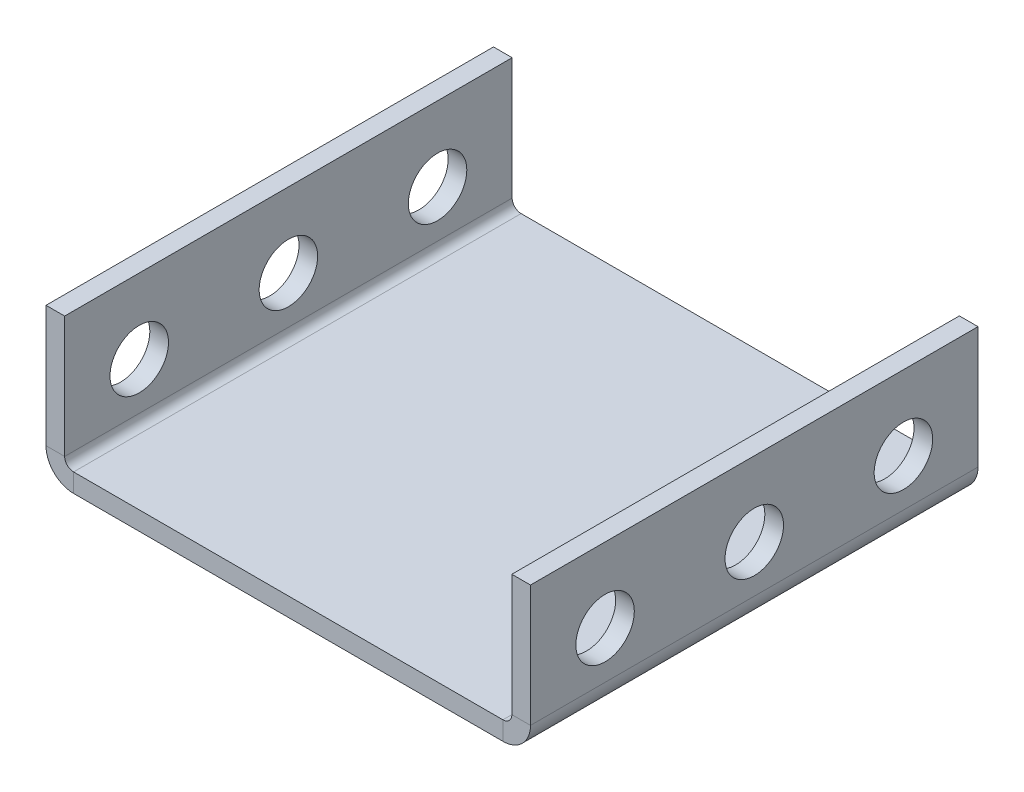
ISO-10303-21;
HEADER;
FILE_DESCRIPTION(('STEP AP214'),'2;1');
FILE_NAME('part.step','',(''),(''),'','','');
FILE_SCHEMA(('AUTOMOTIVE_DESIGN { 1 0 10303 214 1 1 1 1 }'));
ENDSEC;
DATA;
#1=APPLICATION_CONTEXT('core data for automotive mechanical design processes');
#2=APPLICATION_PROTOCOL_DEFINITION('international standard','automotive_design',2000,#1);
#3=PRODUCT_CONTEXT('',#1,'mechanical');
#4=PRODUCT('Part','Part','',(#3));
#5=PRODUCT_RELATED_PRODUCT_CATEGORY('part','',(#4));
#6=PRODUCT_DEFINITION_FORMATION('','',#4);
#7=PRODUCT_DEFINITION_CONTEXT('part definition',#1,'design');
#8=PRODUCT_DEFINITION('design','',#6,#7);
#9=PRODUCT_DEFINITION_SHAPE('','',#8);
#10=(LENGTH_UNIT() NAMED_UNIT(*) SI_UNIT(.MILLI.,.METRE.));
#11=(NAMED_UNIT(*) PLANE_ANGLE_UNIT() SI_UNIT($,.RADIAN.));
#12=(NAMED_UNIT(*) SI_UNIT($,.STERADIAN.) SOLID_ANGLE_UNIT());
#13=UNCERTAINTY_MEASURE_WITH_UNIT(LENGTH_MEASURE(1.E-05),#10,'distance_accuracy_value','');
#14=(GEOMETRIC_REPRESENTATION_CONTEXT(3) GLOBAL_UNCERTAINTY_ASSIGNED_CONTEXT((#13)) GLOBAL_UNIT_ASSIGNED_CONTEXT((#10,
#11,#12)) REPRESENTATION_CONTEXT('',''));
#15=CARTESIAN_POINT('',(0.,0.,0.));
#16=DIRECTION('',(0.,0.,1.));
#17=DIRECTION('',(1.,0.,0.));
#18=AXIS2_PLACEMENT_3D('',#15,#16,#17);
#19=CARTESIAN_POINT('',(18.2753,0.,38.1));
#20=DIRECTION('',(0.,0.,1.));
#21=DIRECTION('',(1.,0.,0.));
#22=AXIS2_PLACEMENT_3D('',#19,#20,#21);
#23=PLANE('',#22);
#24=DIRECTION('',(0.,1.,0.));
#25=VECTOR('',#24,1.);
#26=CARTESIAN_POINT('',(18.2753,0.,38.1));
#27=LINE('',#26,#25);
#28=CARTESIAN_POINT('',(18.2753,0.,38.1));
#29=VERTEX_POINT('',#28);
#30=CARTESIAN_POINT('',(18.2753,1.58750000000001,38.1));
#31=VERTEX_POINT('',#30);
#32=EDGE_CURVE('E11',#29,#31,#27,.T.);
#33=ORIENTED_EDGE('',*,*,#32,.F.);
#34=CARTESIAN_POINT('',(18.2753,2.34950000000001,38.1));
#35=DIRECTION('',(0.,0.,1.));
#36=DIRECTION('',(1.,0.,0.));
#37=AXIS2_PLACEMENT_3D('',#34,#35,#36);
#38=CIRCLE('',#37,2.3495);
#39=CARTESIAN_POINT('',(20.6248,2.34950000000001,38.1));
#40=VERTEX_POINT('',#39);
#41=EDGE_CURVE('E279',#40,#29,#38,.F.);
#42=ORIENTED_EDGE('',*,*,#41,.F.);
#43=DIRECTION('',(1.,0.,0.));
#44=VECTOR('',#43,1.);
#45=CARTESIAN_POINT('',(19.0373,2.34950000000001,38.1));
#46=LINE('',#45,#44);
#47=CARTESIAN_POINT('',(19.0373,2.34950000000001,38.1));
#48=VERTEX_POINT('',#47);
#49=EDGE_CURVE('E54',#48,#40,#46,.T.);
#50=ORIENTED_EDGE('',*,*,#49,.F.);
#51=CARTESIAN_POINT('',(18.2753,2.34950000000001,38.1));
#52=DIRECTION('',(0.,0.,1.));
#53=DIRECTION('',(1.,0.,0.));
#54=AXIS2_PLACEMENT_3D('',#51,#52,#53);
#55=CIRCLE('',#54,0.762);
#56=EDGE_CURVE('E156',#48,#31,#55,.F.);
#57=ORIENTED_EDGE('',*,*,#56,.T.);
#58=EDGE_LOOP('',(#33,#42,#50,#57));
#59=FACE_BOUND('',#58,.T.);
#60=ADVANCED_FACE('F45',(#59),#23,.T.);
#61=CARTESIAN_POINT('',(19.0373,2.34950000000001,38.1));
#62=DIRECTION('',(0.,0.,1.));
#63=DIRECTION('',(1.,0.,0.));
#64=AXIS2_PLACEMENT_3D('',#61,#62,#63);
#65=PLANE('',#64);
#66=DIRECTION('',(-1.,0.,0.));
#67=VECTOR('',#66,1.);
#68=CARTESIAN_POINT('',(-20.6248,0.,38.1));
#69=LINE('',#68,#67);
#70=CARTESIAN_POINT('',(-18.2753,0.,38.1));
#71=VERTEX_POINT('',#70);
#72=EDGE_CURVE('E150',#29,#71,#69,.T.);
#73=ORIENTED_EDGE('',*,*,#72,.F.);
#74=ORIENTED_EDGE('',*,*,#32,.T.);
#75=DIRECTION('',(-1.,0.,0.));
#76=VECTOR('',#75,1.);
#77=CARTESIAN_POINT('',(-20.6248,1.5875,38.1));
#78=LINE('',#77,#76);
#79=CARTESIAN_POINT('',(-18.2753,1.5875,38.1));
#80=VERTEX_POINT('',#79);
#81=EDGE_CURVE('E147',#31,#80,#78,.T.);
#82=ORIENTED_EDGE('',*,*,#81,.T.);
#83=DIRECTION('',(0.,-1.,0.));
#84=VECTOR('',#83,1.);
#85=CARTESIAN_POINT('',(-18.2753,1.5875,38.1));
#86=LINE('',#85,#84);
#87=EDGE_CURVE('E239',#80,#71,#86,.T.);
#88=ORIENTED_EDGE('',*,*,#87,.T.);
#89=EDGE_LOOP('',(#73,#74,#82,#88));
#90=FACE_BOUND('',#89,.T.);
#91=ADVANCED_FACE('F145',(#90),#65,.T.);
#92=CARTESIAN_POINT('',(20.6248,2.34950000000001,0.));
#93=DIRECTION('',(0.,0.,-1.));
#94=DIRECTION('',(-1.,0.,0.));
#95=AXIS2_PLACEMENT_3D('',#92,#93,#94);
#96=PLANE('',#95);
#97=DIRECTION('',(-1.,0.,0.));
#98=VECTOR('',#97,1.);
#99=CARTESIAN_POINT('',(20.6248,2.34950000000001,0.));
#100=LINE('',#99,#98);
#101=CARTESIAN_POINT('',(20.6248,2.34950000000001,0.));
#102=VERTEX_POINT('',#101);
#103=CARTESIAN_POINT('',(19.0373,2.34950000000001,0.));
#104=VERTEX_POINT('',#103);
#105=EDGE_CURVE('E244',#102,#104,#100,.T.);
#106=ORIENTED_EDGE('',*,*,#105,.F.);
#107=CARTESIAN_POINT('',(18.2753,2.34950000000001,0.));
#108=DIRECTION('',(0.,0.,1.));
#109=DIRECTION('',(1.,0.,0.));
#110=AXIS2_PLACEMENT_3D('',#107,#108,#109);
#111=CIRCLE('',#110,2.3495);
#112=CARTESIAN_POINT('',(18.2753,0.,0.));
#113=VERTEX_POINT('',#112);
#114=EDGE_CURVE('E196',#102,#113,#111,.F.);
#115=ORIENTED_EDGE('',*,*,#114,.T.);
#116=DIRECTION('',(0.,-1.,0.));
#117=VECTOR('',#116,1.);
#118=CARTESIAN_POINT('',(18.2753,1.58750000000001,0.));
#119=LINE('',#118,#117);
#120=CARTESIAN_POINT('',(18.2753,1.58750000000001,0.));
#121=VERTEX_POINT('',#120);
#122=EDGE_CURVE('E242',#121,#113,#119,.T.);
#123=ORIENTED_EDGE('',*,*,#122,.F.);
#124=CARTESIAN_POINT('',(18.2753,2.34950000000001,0.));
#125=DIRECTION('',(0.,0.,1.));
#126=DIRECTION('',(1.,0.,0.));
#127=AXIS2_PLACEMENT_3D('',#124,#125,#126);
#128=CIRCLE('',#127,0.762);
#129=EDGE_CURVE('E168',#104,#121,#128,.F.);
#130=ORIENTED_EDGE('',*,*,#129,.F.);
#131=EDGE_LOOP('',(#106,#115,#123,#130));
#132=FACE_BOUND('',#131,.T.);
#133=ADVANCED_FACE('F297',(#132),#96,.T.);
#134=CARTESIAN_POINT('',(18.2753,1.58750000000001,0.));
#135=DIRECTION('',(0.,0.,-1.));
#136=DIRECTION('',(-1.,0.,0.));
#137=AXIS2_PLACEMENT_3D('',#134,#135,#136);
#138=PLANE('',#137);
#139=DIRECTION('',(0.,-1.,0.));
#140=VECTOR('',#139,1.);
#141=CARTESIAN_POINT('',(20.6248,0.,0.));
#142=LINE('',#141,#140);
#143=CARTESIAN_POINT('',(20.6248,12.7,0.));
#144=VERTEX_POINT('',#143);
#145=EDGE_CURVE('E199',#144,#102,#142,.T.);
#146=ORIENTED_EDGE('',*,*,#145,.T.);
#147=ORIENTED_EDGE('',*,*,#105,.T.);
#148=DIRECTION('',(0.,-1.,0.));
#149=VECTOR('',#148,1.);
#150=CARTESIAN_POINT('',(19.0373,0.,0.));
#151=LINE('',#150,#149);
#152=CARTESIAN_POINT('',(19.0373,12.7,0.));
#153=VERTEX_POINT('',#152);
#154=EDGE_CURVE('E205',#153,#104,#151,.T.);
#155=ORIENTED_EDGE('',*,*,#154,.F.);
#156=DIRECTION('',(1.,0.,0.));
#157=VECTOR('',#156,1.);
#158=CARTESIAN_POINT('',(19.0373,12.7,0.));
#159=LINE('',#158,#157);
#160=EDGE_CURVE('E202',#153,#144,#159,.T.);
#161=ORIENTED_EDGE('',*,*,#160,.T.);
#162=EDGE_LOOP('',(#146,#147,#155,#161));
#163=FACE_BOUND('',#162,.T.);
#164=ADVANCED_FACE('F347',(#163),#138,.T.);
#165=CARTESIAN_POINT('',(-20.6248,2.3495,38.1));
#166=DIRECTION('',(0.,0.,1.));
#167=DIRECTION('',(1.,0.,0.));
#168=AXIS2_PLACEMENT_3D('',#165,#166,#167);
#169=PLANE('',#168);
#170=DIRECTION('',(1.,0.,0.));
#171=VECTOR('',#170,1.);
#172=CARTESIAN_POINT('',(-20.6248,2.3495,38.1));
#173=LINE('',#172,#171);
#174=CARTESIAN_POINT('',(-20.6248,2.3495,38.1));
#175=VERTEX_POINT('',#174);
#176=CARTESIAN_POINT('',(-19.0373,2.3495,38.1));
#177=VERTEX_POINT('',#176);
#178=EDGE_CURVE('E63',#175,#177,#173,.T.);
#179=ORIENTED_EDGE('',*,*,#178,.F.);
#180=CARTESIAN_POINT('',(-18.2753,2.3495,38.1));
#181=DIRECTION('',(0.,0.,1.));
#182=DIRECTION('',(1.,0.,0.));
#183=AXIS2_PLACEMENT_3D('',#180,#181,#182);
#184=CIRCLE('',#183,2.3495);
#185=EDGE_CURVE('E275',#71,#175,#184,.F.);
#186=ORIENTED_EDGE('',*,*,#185,.F.);
#187=ORIENTED_EDGE('',*,*,#87,.F.);
#188=CARTESIAN_POINT('',(-18.2753,2.3495,38.1));
#189=DIRECTION('',(0.,0.,1.));
#190=DIRECTION('',(1.,0.,0.));
#191=AXIS2_PLACEMENT_3D('',#188,#189,#190);
#192=CIRCLE('',#191,0.762);
#193=EDGE_CURVE('E176',#80,#177,#192,.F.);
#194=ORIENTED_EDGE('',*,*,#193,.T.);
#195=EDGE_LOOP('',(#179,#186,#187,#194));
#196=FACE_BOUND('',#195,.T.);
#197=ADVANCED_FACE('F352',(#196),#169,.T.);
#198=CARTESIAN_POINT('',(-18.2753,1.5875,38.1));
#199=DIRECTION('',(0.,0.,1.));
#200=DIRECTION('',(1.,0.,0.));
#201=AXIS2_PLACEMENT_3D('',#198,#199,#200);
#202=PLANE('',#201);
#203=DIRECTION('',(0.,1.,0.));
#204=VECTOR('',#203,1.);
#205=CARTESIAN_POINT('',(-20.6248,0.,38.1));
#206=LINE('',#205,#204);
#207=CARTESIAN_POINT('',(-20.6248,12.7,38.1));
#208=VERTEX_POINT('',#207);
#209=EDGE_CURVE('E272',#175,#208,#206,.T.);
#210=ORIENTED_EDGE('',*,*,#209,.F.);
#211=ORIENTED_EDGE('',*,*,#178,.T.);
#212=DIRECTION('',(0.,1.,0.));
#213=VECTOR('',#212,1.);
#214=CARTESIAN_POINT('',(-19.0373,0.,38.1));
#215=LINE('',#214,#213);
#216=CARTESIAN_POINT('',(-19.0373,12.7,38.1));
#217=VERTEX_POINT('',#216);
#218=EDGE_CURVE('E117',#177,#217,#215,.T.);
#219=ORIENTED_EDGE('',*,*,#218,.T.);
#220=DIRECTION('',(1.,0.,0.));
#221=VECTOR('',#220,1.);
#222=CARTESIAN_POINT('',(-20.6248,12.7,38.1));
#223=LINE('',#222,#221);
#224=EDGE_CURVE('E269',#208,#217,#223,.T.);
#225=ORIENTED_EDGE('',*,*,#224,.F.);
#226=EDGE_LOOP('',(#210,#211,#219,#225));
#227=FACE_BOUND('',#226,.T.);
#228=ADVANCED_FACE('F324',(#227),#202,.T.);
#229=CARTESIAN_POINT('',(-18.2753,0.,0.));
#230=DIRECTION('',(0.,0.,-1.));
#231=DIRECTION('',(-1.,0.,0.));
#232=AXIS2_PLACEMENT_3D('',#229,#230,#231);
#233=PLANE('',#232);
#234=DIRECTION('',(0.,1.,0.));
#235=VECTOR('',#234,1.);
#236=CARTESIAN_POINT('',(-18.2753,0.,0.));
#237=LINE('',#236,#235);
#238=CARTESIAN_POINT('',(-18.2753,0.,0.));
#239=VERTEX_POINT('',#238);
#240=CARTESIAN_POINT('',(-18.2753,1.5875,0.));
#241=VERTEX_POINT('',#240);
#242=EDGE_CURVE('E104',#239,#241,#237,.T.);
#243=ORIENTED_EDGE('',*,*,#242,.F.);
#244=CARTESIAN_POINT('',(-18.2753,2.3495,0.));
#245=DIRECTION('',(0.,0.,1.));
#246=DIRECTION('',(1.,0.,0.));
#247=AXIS2_PLACEMENT_3D('',#244,#245,#246);
#248=CIRCLE('',#247,2.3495);
#249=CARTESIAN_POINT('',(-20.6248,2.3495,0.));
#250=VERTEX_POINT('',#249);
#251=EDGE_CURVE('E192',#239,#250,#248,.F.);
#252=ORIENTED_EDGE('',*,*,#251,.T.);
#253=DIRECTION('',(-1.,0.,0.));
#254=VECTOR('',#253,1.);
#255=CARTESIAN_POINT('',(-19.0373,2.3495,0.));
#256=LINE('',#255,#254);
#257=CARTESIAN_POINT('',(-19.0373,2.3495,0.));
#258=VERTEX_POINT('',#257);
#259=EDGE_CURVE('E111',#258,#250,#256,.T.);
#260=ORIENTED_EDGE('',*,*,#259,.F.);
#261=CARTESIAN_POINT('',(-18.2753,2.3495,0.));
#262=DIRECTION('',(0.,0.,1.));
#263=DIRECTION('',(1.,0.,0.));
#264=AXIS2_PLACEMENT_3D('',#261,#262,#263);
#265=CIRCLE('',#264,0.762);
#266=EDGE_CURVE('E211',#241,#258,#265,.F.);
#267=ORIENTED_EDGE('',*,*,#266,.F.);
#268=EDGE_LOOP('',(#243,#252,#260,#267));
#269=FACE_BOUND('',#268,.T.);
#270=ADVANCED_FACE('F312',(#269),#233,.T.);
#271=CARTESIAN_POINT('',(-19.0373,2.3495,0.));
#272=DIRECTION('',(0.,0.,-1.));
#273=DIRECTION('',(-1.,0.,0.));
#274=AXIS2_PLACEMENT_3D('',#271,#272,#273);
#275=PLANE('',#274);
#276=DIRECTION('',(-1.,0.,0.));
#277=VECTOR('',#276,1.);
#278=CARTESIAN_POINT('',(-20.6248,0.,0.));
#279=LINE('',#278,#277);
#280=EDGE_CURVE('E194',#113,#239,#279,.T.);
#281=ORIENTED_EDGE('',*,*,#280,.T.);
#282=ORIENTED_EDGE('',*,*,#242,.T.);
#283=DIRECTION('',(-1.,0.,0.));
#284=VECTOR('',#283,1.);
#285=CARTESIAN_POINT('',(-20.6248,1.5875,0.));
#286=LINE('',#285,#284);
#287=EDGE_CURVE('E209',#121,#241,#286,.T.);
#288=ORIENTED_EDGE('',*,*,#287,.F.);
#289=ORIENTED_EDGE('',*,*,#122,.T.);
#290=EDGE_LOOP('',(#281,#282,#288,#289));
#291=FACE_BOUND('',#290,.T.);
#292=ADVANCED_FACE('F299',(#291),#275,.T.);
#293=CARTESIAN_POINT('',(-19.0373,0.,38.1));
#294=DIRECTION('',(-1.,0.,0.));
#295=DIRECTION('',(0.,-1.,0.));
#296=AXIS2_PLACEMENT_3D('',#293,#294,#295);
#297=PLANE('',#296);
#298=CARTESIAN_POINT('',(-19.0373,6.35000000000001,31.75));
#299=DIRECTION('',(-1.,0.,0.));
#300=DIRECTION('',(0.,-1.,0.));
#301=AXIS2_PLACEMENT_3D('',#298,#299,#300);
#302=CIRCLE('',#301,2.4892);
#303=CARTESIAN_POINT('',(-19.0373,3.86080000000001,31.75));
#304=VERTEX_POINT('',#303);
#305=EDGE_CURVE('E186',#304,#304,#302,.T.);
#306=ORIENTED_EDGE('',*,*,#305,.T.);
#307=EDGE_LOOP('',(#306));
#308=FACE_BOUND('',#307,.T.);
#309=CARTESIAN_POINT('',(-19.0373,6.35000000000001,19.05));
#310=DIRECTION('',(-1.,0.,0.));
#311=DIRECTION('',(0.,-1.,0.));
#312=AXIS2_PLACEMENT_3D('',#309,#310,#311);
#313=CIRCLE('',#312,2.4892);
#314=CARTESIAN_POINT('',(-19.0373,3.8608,19.05));
#315=VERTEX_POINT('',#314);
#316=EDGE_CURVE('E253',#315,#315,#313,.T.);
#317=ORIENTED_EDGE('',*,*,#316,.T.);
#318=EDGE_LOOP('',(#317));
#319=FACE_BOUND('',#318,.T.);
#320=CARTESIAN_POINT('',(-19.0373,6.35000000000001,6.35000000000001));
#321=DIRECTION('',(-1.,0.,0.));
#322=DIRECTION('',(0.,-1.,0.));
#323=AXIS2_PLACEMENT_3D('',#320,#321,#322);
#324=CIRCLE('',#323,2.4892);
#325=CARTESIAN_POINT('',(-19.0373,3.86080000000001,6.35000000000001));
#326=VERTEX_POINT('',#325);
#327=EDGE_CURVE('E249',#326,#326,#324,.T.);
#328=ORIENTED_EDGE('',*,*,#327,.T.);
#329=EDGE_LOOP('',(#328));
#330=FACE_BOUND('',#329,.T.);
#331=DIRECTION('',(0.,1.,0.));
#332=VECTOR('',#331,1.);
#333=CARTESIAN_POINT('',(-19.0373,0.,0.));
#334=LINE('',#333,#332);
#335=CARTESIAN_POINT('',(-19.0373,12.7,0.));
#336=VERTEX_POINT('',#335);
#337=EDGE_CURVE('E182',#258,#336,#334,.T.);
#338=ORIENTED_EDGE('',*,*,#337,.T.);
#339=DIRECTION('',(0.,0.,-1.));
#340=VECTOR('',#339,1.);
#341=CARTESIAN_POINT('',(-19.0373,12.7,38.1));
#342=LINE('',#341,#340);
#343=EDGE_CURVE('E235',#217,#336,#342,.T.);
#344=ORIENTED_EDGE('',*,*,#343,.F.);
#345=ORIENTED_EDGE('',*,*,#218,.F.);
#346=DIRECTION('',(0.,0.,-1.));
#347=VECTOR('',#346,1.);
#348=CARTESIAN_POINT('',(-19.0373,2.3495,38.1));
#349=LINE('',#348,#347);
#350=EDGE_CURVE('E178',#177,#258,#349,.T.);
#351=ORIENTED_EDGE('',*,*,#350,.T.);
#352=EDGE_LOOP('',(#338,#344,#345,#351));
#353=FACE_BOUND('',#352,.T.);
#354=ADVANCED_FACE('F318',(#308,#319,#330,#353),#297,.F.);
#355=CARTESIAN_POINT('',(-20.6248,12.7,38.1));
#356=DIRECTION('',(0.,1.,0.));
#357=DIRECTION('',(0.,0.,1.));
#358=AXIS2_PLACEMENT_3D('',#355,#356,#357);
#359=PLANE('',#358);
#360=DIRECTION('',(1.,0.,0.));
#361=VECTOR('',#360,1.);
#362=CARTESIAN_POINT('',(-20.6248,12.7,0.));
#363=LINE('',#362,#361);
#364=CARTESIAN_POINT('',(-20.6248,12.7,0.));
#365=VERTEX_POINT('',#364);
#366=EDGE_CURVE('E185',#365,#336,#363,.T.);
#367=ORIENTED_EDGE('',*,*,#366,.F.);
#368=DIRECTION('',(0.,0.,-1.));
#369=VECTOR('',#368,1.);
#370=CARTESIAN_POINT('',(-20.6248,12.7,38.1));
#371=LINE('',#370,#369);
#372=EDGE_CURVE('E233',#208,#365,#371,.T.);
#373=ORIENTED_EDGE('',*,*,#372,.F.);
#374=ORIENTED_EDGE('',*,*,#224,.T.);
#375=ORIENTED_EDGE('',*,*,#343,.T.);
#376=EDGE_LOOP('',(#367,#373,#374,#375));
#377=FACE_BOUND('',#376,.T.);
#378=ADVANCED_FACE('F323',(#377),#359,.T.);
#379=CARTESIAN_POINT('',(-20.6248,0.,38.1));
#380=DIRECTION('',(-1.,0.,0.));
#381=DIRECTION('',(0.,-1.,0.));
#382=AXIS2_PLACEMENT_3D('',#379,#380,#381);
#383=PLANE('',#382);
#384=CARTESIAN_POINT('',(-20.6248,6.35000000000001,31.75));
#385=DIRECTION('',(1.,0.,0.));
#386=DIRECTION('',(0.,0.,-1.));
#387=AXIS2_PLACEMENT_3D('',#384,#385,#386);
#388=CIRCLE('',#387,2.4892);
#389=CARTESIAN_POINT('',(-20.6248,6.35000000000001,29.2608));
#390=VERTEX_POINT('',#389);
#391=EDGE_CURVE('E250',#390,#390,#388,.T.);
#392=ORIENTED_EDGE('',*,*,#391,.T.);
#393=EDGE_LOOP('',(#392));
#394=FACE_BOUND('',#393,.T.);
#395=CARTESIAN_POINT('',(-20.6248,6.35000000000001,19.05));
#396=DIRECTION('',(1.,0.,0.));
#397=DIRECTION('',(0.,0.,-1.));
#398=AXIS2_PLACEMENT_3D('',#395,#396,#397);
#399=CIRCLE('',#398,2.4892);
#400=CARTESIAN_POINT('',(-20.6248,6.35000000000001,16.5608));
#401=VERTEX_POINT('',#400);
#402=EDGE_CURVE('E403',#401,#401,#399,.T.);
#403=ORIENTED_EDGE('',*,*,#402,.T.);
#404=EDGE_LOOP('',(#403));
#405=FACE_BOUND('',#404,.T.);
#406=CARTESIAN_POINT('',(-20.6248,6.35000000000001,6.35000000000001));
#407=DIRECTION('',(1.,0.,0.));
#408=DIRECTION('',(0.,0.,-1.));
#409=AXIS2_PLACEMENT_3D('',#406,#407,#408);
#410=CIRCLE('',#409,2.4892);
#411=CARTESIAN_POINT('',(-20.6248,6.35000000000001,3.86080000000001));
#412=VERTEX_POINT('',#411);
#413=EDGE_CURVE('E410',#412,#412,#410,.T.);
#414=ORIENTED_EDGE('',*,*,#413,.T.);
#415=EDGE_LOOP('',(#414));
#416=FACE_BOUND('',#415,.T.);
#417=DIRECTION('',(0.,1.,0.));
#418=VECTOR('',#417,1.);
#419=CARTESIAN_POINT('',(-20.6248,0.,0.));
#420=LINE('',#419,#418);
#421=EDGE_CURVE('E189',#250,#365,#420,.T.);
#422=ORIENTED_EDGE('',*,*,#421,.F.);
#423=DIRECTION('',(0.,0.,-1.));
#424=VECTOR('',#423,1.);
#425=CARTESIAN_POINT('',(-20.6248,2.3495,38.1));
#426=LINE('',#425,#424);
#427=EDGE_CURVE('E230',#175,#250,#426,.T.);
#428=ORIENTED_EDGE('',*,*,#427,.F.);
#429=ORIENTED_EDGE('',*,*,#209,.T.);
#430=ORIENTED_EDGE('',*,*,#372,.T.);
#431=EDGE_LOOP('',(#422,#428,#429,#430));
#432=FACE_BOUND('',#431,.T.);
#433=ADVANCED_FACE('F326',(#394,#405,#416,#432),#383,.T.);
#434=CARTESIAN_POINT('',(-18.2753,2.3495,38.1));
#435=DIRECTION('',(0.,0.,-1.));
#436=DIRECTION('',(-1.,0.,0.));
#437=AXIS2_PLACEMENT_3D('',#434,#435,#436);
#438=CYLINDRICAL_SURFACE('',#437,2.3495);
#439=ORIENTED_EDGE('',*,*,#251,.F.);
#440=DIRECTION('',(0.,0.,-1.));
#441=VECTOR('',#440,1.);
#442=CARTESIAN_POINT('',(-18.2753,0.,38.1));
#443=LINE('',#442,#441);
#444=EDGE_CURVE('E227',#71,#239,#443,.T.);
#445=ORIENTED_EDGE('',*,*,#444,.F.);
#446=ORIENTED_EDGE('',*,*,#185,.T.);
#447=ORIENTED_EDGE('',*,*,#427,.T.);
#448=EDGE_LOOP('',(#439,#445,#446,#447));
#449=FACE_BOUND('',#448,.T.);
#450=ADVANCED_FACE('F309',(#449),#438,.T.);
#451=CARTESIAN_POINT('',(-20.6248,0.,38.1));
#452=DIRECTION('',(0.,-1.,0.));
#453=DIRECTION('',(1.,0.,0.));
#454=AXIS2_PLACEMENT_3D('',#451,#452,#453);
#455=PLANE('',#454);
#456=ORIENTED_EDGE('',*,*,#280,.F.);
#457=DIRECTION('',(0.,0.,-1.));
#458=VECTOR('',#457,1.);
#459=CARTESIAN_POINT('',(18.2753,0.,38.1));
#460=LINE('',#459,#458);
#461=EDGE_CURVE('E224',#29,#113,#460,.T.);
#462=ORIENTED_EDGE('',*,*,#461,.F.);
#463=ORIENTED_EDGE('',*,*,#72,.T.);
#464=ORIENTED_EDGE('',*,*,#444,.T.);
#465=EDGE_LOOP('',(#456,#462,#463,#464));
#466=FACE_BOUND('',#465,.T.);
#467=ADVANCED_FACE('F304',(#466),#455,.T.);
#468=CARTESIAN_POINT('',(18.2753,2.34950000000001,38.1));
#469=DIRECTION('',(0.,0.,-1.));
#470=DIRECTION('',(-1.,0.,0.));
#471=AXIS2_PLACEMENT_3D('',#468,#469,#470);
#472=CYLINDRICAL_SURFACE('',#471,2.3495);
#473=ORIENTED_EDGE('',*,*,#114,.F.);
#474=DIRECTION('',(0.,0.,-1.));
#475=VECTOR('',#474,1.);
#476=CARTESIAN_POINT('',(20.6248,2.34950000000001,38.1));
#477=LINE('',#476,#475);
#478=EDGE_CURVE('E221',#40,#102,#477,.T.);
#479=ORIENTED_EDGE('',*,*,#478,.F.);
#480=ORIENTED_EDGE('',*,*,#41,.T.);
#481=ORIENTED_EDGE('',*,*,#461,.T.);
#482=EDGE_LOOP('',(#473,#479,#480,#481));
#483=FACE_BOUND('',#482,.T.);
#484=ADVANCED_FACE('F302',(#483),#472,.T.);
#485=CARTESIAN_POINT('',(20.6248,0.,38.1));
#486=DIRECTION('',(1.,0.,0.));
#487=DIRECTION('',(0.,1.,0.));
#488=AXIS2_PLACEMENT_3D('',#485,#486,#487);
#489=PLANE('',#488);
#490=CARTESIAN_POINT('',(20.6248,6.35000000000001,31.75));
#491=DIRECTION('',(1.,0.,0.));
#492=DIRECTION('',(0.,0.,-1.));
#493=AXIS2_PLACEMENT_3D('',#490,#491,#492);
#494=CIRCLE('',#493,2.4892);
#495=CARTESIAN_POINT('',(20.6248,6.35000000000001,29.2608));
#496=VERTEX_POINT('',#495);
#497=EDGE_CURVE('E402',#496,#496,#494,.T.);
#498=ORIENTED_EDGE('',*,*,#497,.F.);
#499=EDGE_LOOP('',(#498));
#500=FACE_BOUND('',#499,.T.);
#501=CARTESIAN_POINT('',(20.6248,6.35000000000001,19.05));
#502=DIRECTION('',(1.,0.,0.));
#503=DIRECTION('',(0.,0.,-1.));
#504=AXIS2_PLACEMENT_3D('',#501,#502,#503);
#505=CIRCLE('',#504,2.4892);
#506=CARTESIAN_POINT('',(20.6248,6.35000000000001,16.5608));
#507=VERTEX_POINT('',#506);
#508=EDGE_CURVE('E400',#507,#507,#505,.T.);
#509=ORIENTED_EDGE('',*,*,#508,.F.);
#510=EDGE_LOOP('',(#509));
#511=FACE_BOUND('',#510,.T.);
#512=CARTESIAN_POINT('',(20.6248,6.35000000000001,6.35000000000001));
#513=DIRECTION('',(1.,0.,0.));
#514=DIRECTION('',(0.,0.,-1.));
#515=AXIS2_PLACEMENT_3D('',#512,#513,#514);
#516=CIRCLE('',#515,2.4892);
#517=CARTESIAN_POINT('',(20.6248,6.35000000000001,3.86080000000001));
#518=VERTEX_POINT('',#517);
#519=EDGE_CURVE('E263',#518,#518,#516,.T.);
#520=ORIENTED_EDGE('',*,*,#519,.F.);
#521=EDGE_LOOP('',(#520));
#522=FACE_BOUND('',#521,.T.);
#523=ORIENTED_EDGE('',*,*,#145,.F.);
#524=DIRECTION('',(0.,0.,-1.));
#525=VECTOR('',#524,1.);
#526=CARTESIAN_POINT('',(20.6248,12.7,38.1));
#527=LINE('',#526,#525);
#528=CARTESIAN_POINT('',(20.6248,12.7,38.1));
#529=VERTEX_POINT('',#528);
#530=EDGE_CURVE('E219',#529,#144,#527,.T.);
#531=ORIENTED_EDGE('',*,*,#530,.F.);
#532=DIRECTION('',(0.,-1.,0.));
#533=VECTOR('',#532,1.);
#534=CARTESIAN_POINT('',(20.6248,0.,38.1));
#535=LINE('',#534,#533);
#536=EDGE_CURVE('E281',#529,#40,#535,.T.);
#537=ORIENTED_EDGE('',*,*,#536,.T.);
#538=ORIENTED_EDGE('',*,*,#478,.T.);
#539=EDGE_LOOP('',(#523,#531,#537,#538));
#540=FACE_BOUND('',#539,.T.);
#541=ADVANCED_FACE('F418',(#500,#511,#522,#540),#489,.T.);
#542=CARTESIAN_POINT('',(19.0373,12.7,38.1));
#543=DIRECTION('',(0.,1.,0.));
#544=DIRECTION('',(0.,0.,1.));
#545=AXIS2_PLACEMENT_3D('',#542,#543,#544);
#546=PLANE('',#545);
#547=ORIENTED_EDGE('',*,*,#160,.F.);
#548=DIRECTION('',(0.,0.,-1.));
#549=VECTOR('',#548,1.);
#550=CARTESIAN_POINT('',(19.0373,12.7,38.1));
#551=LINE('',#550,#549);
#552=CARTESIAN_POINT('',(19.0373,12.7,38.1));
#553=VERTEX_POINT('',#552);
#554=EDGE_CURVE('E217',#553,#153,#551,.T.);
#555=ORIENTED_EDGE('',*,*,#554,.F.);
#556=DIRECTION('',(1.,0.,0.));
#557=VECTOR('',#556,1.);
#558=CARTESIAN_POINT('',(19.0373,12.7,38.1));
#559=LINE('',#558,#557);
#560=EDGE_CURVE('E284',#553,#529,#559,.T.);
#561=ORIENTED_EDGE('',*,*,#560,.T.);
#562=ORIENTED_EDGE('',*,*,#530,.T.);
#563=EDGE_LOOP('',(#547,#555,#561,#562));
#564=FACE_BOUND('',#563,.T.);
#565=ADVANCED_FACE('F420',(#564),#546,.T.);
#566=CARTESIAN_POINT('',(19.0373,0.,38.1));
#567=DIRECTION('',(1.,0.,0.));
#568=DIRECTION('',(0.,1.,0.));
#569=AXIS2_PLACEMENT_3D('',#566,#567,#568);
#570=PLANE('',#569);
#571=CARTESIAN_POINT('',(19.0373,6.35000000000001,31.75));
#572=DIRECTION('',(1.,0.,0.));
#573=DIRECTION('',(0.,1.,0.));
#574=AXIS2_PLACEMENT_3D('',#571,#572,#573);
#575=CIRCLE('',#574,2.4892);
#576=CARTESIAN_POINT('',(19.0373,8.8392,31.75));
#577=VERTEX_POINT('',#576);
#578=EDGE_CURVE('E48',#577,#577,#575,.T.);
#579=ORIENTED_EDGE('',*,*,#578,.T.);
#580=EDGE_LOOP('',(#579));
#581=FACE_BOUND('',#580,.T.);
#582=CARTESIAN_POINT('',(19.0373,6.35000000000001,19.05));
#583=DIRECTION('',(1.,0.,0.));
#584=DIRECTION('',(0.,1.,0.));
#585=AXIS2_PLACEMENT_3D('',#582,#583,#584);
#586=CIRCLE('',#585,2.4892);
#587=CARTESIAN_POINT('',(19.0373,8.83920000000001,19.05));
#588=VERTEX_POINT('',#587);
#589=EDGE_CURVE('E251',#588,#588,#586,.T.);
#590=ORIENTED_EDGE('',*,*,#589,.T.);
#591=EDGE_LOOP('',(#590));
#592=FACE_BOUND('',#591,.T.);
#593=CARTESIAN_POINT('',(19.0373,6.35000000000001,6.35000000000001));
#594=DIRECTION('',(1.,0.,0.));
#595=DIRECTION('',(0.,1.,0.));
#596=AXIS2_PLACEMENT_3D('',#593,#594,#595);
#597=CIRCLE('',#596,2.4892);
#598=CARTESIAN_POINT('',(19.0373,8.8392,6.35000000000001));
#599=VERTEX_POINT('',#598);
#600=EDGE_CURVE('E247',#599,#599,#597,.T.);
#601=ORIENTED_EDGE('',*,*,#600,.T.);
#602=EDGE_LOOP('',(#601));
#603=FACE_BOUND('',#602,.T.);
#604=ORIENTED_EDGE('',*,*,#154,.T.);
#605=DIRECTION('',(0.,0.,-1.));
#606=VECTOR('',#605,1.);
#607=CARTESIAN_POINT('',(19.0373,2.34950000000001,38.1));
#608=LINE('',#607,#606);
#609=EDGE_CURVE('E170',#48,#104,#608,.T.);
#610=ORIENTED_EDGE('',*,*,#609,.F.);
#611=DIRECTION('',(0.,-1.,0.));
#612=VECTOR('',#611,1.);
#613=CARTESIAN_POINT('',(19.0373,0.,38.1));
#614=LINE('',#613,#612);
#615=EDGE_CURVE('E161',#553,#48,#614,.T.);
#616=ORIENTED_EDGE('',*,*,#615,.F.);
#617=ORIENTED_EDGE('',*,*,#554,.T.);
#618=EDGE_LOOP('',(#604,#610,#616,#617));
#619=FACE_BOUND('',#618,.T.);
#620=ADVANCED_FACE('F294',(#581,#592,#603,#619),#570,.F.);
#621=CARTESIAN_POINT('',(18.2753,2.34950000000001,38.1));
#622=DIRECTION('',(0.,0.,-1.));
#623=DIRECTION('',(-1.,0.,0.));
#624=AXIS2_PLACEMENT_3D('',#621,#622,#623);
#625=CYLINDRICAL_SURFACE('',#624,0.762);
#626=ORIENTED_EDGE('',*,*,#129,.T.);
#627=DIRECTION('',(0.,0.,-1.));
#628=VECTOR('',#627,1.);
#629=CARTESIAN_POINT('',(18.2753,1.58750000000001,38.1));
#630=LINE('',#629,#628);
#631=EDGE_CURVE('E165',#31,#121,#630,.T.);
#632=ORIENTED_EDGE('',*,*,#631,.F.);
#633=ORIENTED_EDGE('',*,*,#56,.F.);
#634=ORIENTED_EDGE('',*,*,#609,.T.);
#635=EDGE_LOOP('',(#626,#632,#633,#634));
#636=FACE_BOUND('',#635,.T.);
#637=ADVANCED_FACE('F166',(#636),#625,.F.);
#638=CARTESIAN_POINT('',(-20.6248,1.5875,38.1));
#639=DIRECTION('',(0.,-1.,0.));
#640=DIRECTION('',(1.,0.,0.));
#641=AXIS2_PLACEMENT_3D('',#638,#639,#640);
#642=PLANE('',#641);
#643=ORIENTED_EDGE('',*,*,#287,.T.);
#644=DIRECTION('',(0.,0.,-1.));
#645=VECTOR('',#644,1.);
#646=CARTESIAN_POINT('',(-18.2753,1.5875,38.1));
#647=LINE('',#646,#645);
#648=EDGE_CURVE('E171',#80,#241,#647,.T.);
#649=ORIENTED_EDGE('',*,*,#648,.F.);
#650=ORIENTED_EDGE('',*,*,#81,.F.);
#651=ORIENTED_EDGE('',*,*,#631,.T.);
#652=EDGE_LOOP('',(#643,#649,#650,#651));
#653=FACE_BOUND('',#652,.T.);
#654=ADVANCED_FACE('F173',(#653),#642,.F.);
#655=CARTESIAN_POINT('',(-18.2753,2.3495,38.1));
#656=DIRECTION('',(0.,0.,-1.));
#657=DIRECTION('',(-1.,0.,0.));
#658=AXIS2_PLACEMENT_3D('',#655,#656,#657);
#659=CYLINDRICAL_SURFACE('',#658,0.762);
#660=ORIENTED_EDGE('',*,*,#266,.T.);
#661=ORIENTED_EDGE('',*,*,#350,.F.);
#662=ORIENTED_EDGE('',*,*,#193,.F.);
#663=ORIENTED_EDGE('',*,*,#648,.T.);
#664=EDGE_LOOP('',(#660,#661,#662,#663));
#665=FACE_BOUND('',#664,.T.);
#666=ADVANCED_FACE('F315',(#665),#659,.F.);
#667=CARTESIAN_POINT('',(-18.2753,2.3495,38.1));
#668=DIRECTION('',(0.,0.,1.));
#669=DIRECTION('',(1.,0.,0.));
#670=AXIS2_PLACEMENT_3D('',#667,#668,#669);
#671=PLANE('',#670);
#672=ORIENTED_EDGE('',*,*,#615,.T.);
#673=ORIENTED_EDGE('',*,*,#49,.T.);
#674=ORIENTED_EDGE('',*,*,#536,.F.);
#675=ORIENTED_EDGE('',*,*,#560,.F.);
#676=EDGE_LOOP('',(#672,#673,#674,#675));
#677=FACE_BOUND('',#676,.T.);
#678=ADVANCED_FACE('F290',(#677),#671,.T.);
#679=CARTESIAN_POINT('',(-18.2753,2.3495,0.));
#680=DIRECTION('',(0.,0.,1.));
#681=DIRECTION('',(1.,0.,0.));
#682=AXIS2_PLACEMENT_3D('',#679,#680,#681);
#683=PLANE('',#682);
#684=ORIENTED_EDGE('',*,*,#337,.F.);
#685=ORIENTED_EDGE('',*,*,#259,.T.);
#686=ORIENTED_EDGE('',*,*,#421,.T.);
#687=ORIENTED_EDGE('',*,*,#366,.T.);
#688=EDGE_LOOP('',(#684,#685,#686,#687));
#689=FACE_BOUND('',#688,.T.);
#690=ADVANCED_FACE('F320',(#689),#683,.F.);
#691=CARTESIAN_POINT('',(-20.6248,6.35000000000001,6.35000000000001));
#692=DIRECTION('',(1.,0.,0.));
#693=DIRECTION('',(0.,0.,-1.));
#694=AXIS2_PLACEMENT_3D('',#691,#692,#693);
#695=CYLINDRICAL_SURFACE('',#694,2.4892);
#696=ORIENTED_EDGE('',*,*,#519,.T.);
#697=EDGE_LOOP('',(#696));
#698=FACE_BOUND('',#697,.T.);
#699=ORIENTED_EDGE('',*,*,#600,.F.);
#700=EDGE_LOOP('',(#699));
#701=FACE_BOUND('',#700,.T.);
#702=ADVANCED_FACE('F387',(#698,#701),#695,.F.);
#703=CARTESIAN_POINT('',(-20.6248,6.35000000000001,19.05));
#704=DIRECTION('',(1.,0.,0.));
#705=DIRECTION('',(0.,0.,-1.));
#706=AXIS2_PLACEMENT_3D('',#703,#704,#705);
#707=CYLINDRICAL_SURFACE('',#706,2.4892);
#708=ORIENTED_EDGE('',*,*,#508,.T.);
#709=EDGE_LOOP('',(#708));
#710=FACE_BOUND('',#709,.T.);
#711=ORIENTED_EDGE('',*,*,#589,.F.);
#712=EDGE_LOOP('',(#711));
#713=FACE_BOUND('',#712,.T.);
#714=ADVANCED_FACE('F377',(#710,#713),#707,.F.);
#715=CARTESIAN_POINT('',(-20.6248,6.35000000000001,31.75));
#716=DIRECTION('',(1.,0.,0.));
#717=DIRECTION('',(0.,0.,-1.));
#718=AXIS2_PLACEMENT_3D('',#715,#716,#717);
#719=CYLINDRICAL_SURFACE('',#718,2.4892);
#720=ORIENTED_EDGE('',*,*,#497,.T.);
#721=EDGE_LOOP('',(#720));
#722=FACE_BOUND('',#721,.T.);
#723=ORIENTED_EDGE('',*,*,#578,.F.);
#724=EDGE_LOOP('',(#723));
#725=FACE_BOUND('',#724,.T.);
#726=ADVANCED_FACE('F384',(#722,#725),#719,.F.);
#727=ORIENTED_EDGE('',*,*,#413,.F.);
#728=EDGE_LOOP('',(#727));
#729=FACE_BOUND('',#728,.T.);
#730=ORIENTED_EDGE('',*,*,#327,.F.);
#731=EDGE_LOOP('',(#730));
#732=FACE_BOUND('',#731,.T.);
#733=ADVANCED_FACE('F374',(#729,#732),#695,.F.);
#734=ORIENTED_EDGE('',*,*,#402,.F.);
#735=EDGE_LOOP('',(#734));
#736=FACE_BOUND('',#735,.T.);
#737=ORIENTED_EDGE('',*,*,#316,.F.);
#738=EDGE_LOOP('',(#737));
#739=FACE_BOUND('',#738,.T.);
#740=ADVANCED_FACE('F371',(#736,#739),#707,.F.);
#741=ORIENTED_EDGE('',*,*,#391,.F.);
#742=EDGE_LOOP('',(#741));
#743=FACE_BOUND('',#742,.T.);
#744=ORIENTED_EDGE('',*,*,#305,.F.);
#745=EDGE_LOOP('',(#744));
#746=FACE_BOUND('',#745,.T.);
#747=ADVANCED_FACE('F373',(#743,#746),#719,.F.);
#748=CLOSED_SHELL('',(#60,#91,#133,#164,#197,#228,#270,#292,#354,#378,#433,#450,#467,#484,#541,
#565,#620,#637,#654,#666,#678,#690,#702,#714,#726,#733,#740,#747));
#749=MANIFOLD_SOLID_BREP('B2',#748);
#750=ADVANCED_BREP_SHAPE_REPRESENTATION('',(#18,#749),#14);
#751=SHAPE_DEFINITION_REPRESENTATION(#9,#750);
ENDSEC;
END-ISO-10303-21;
